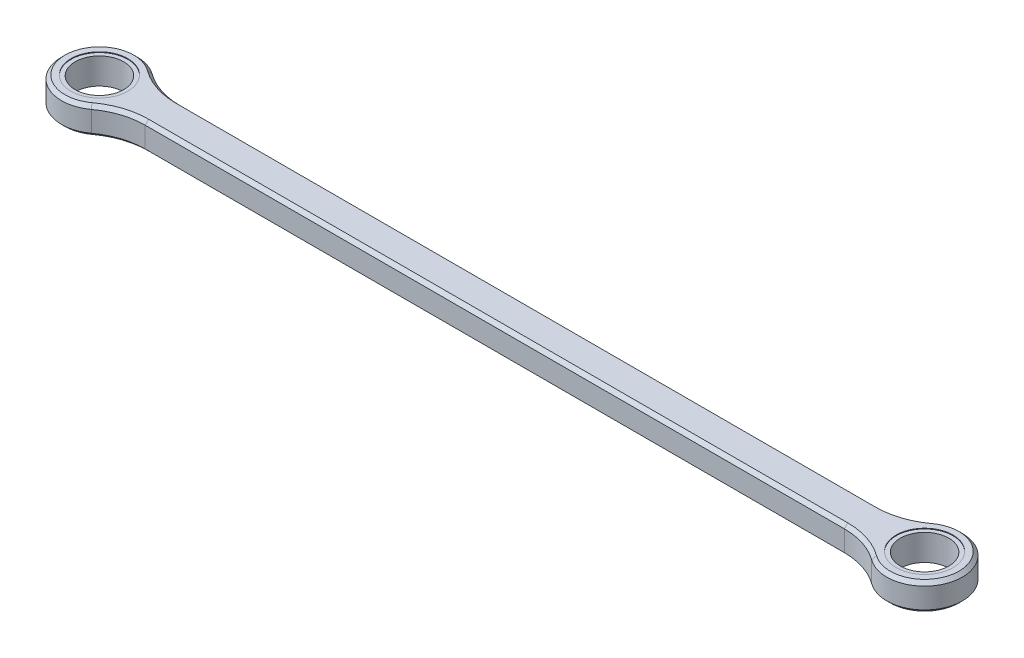
ISO-10303-21;
HEADER;
FILE_DESCRIPTION(('STEP AP214'),'2;1');
FILE_NAME('part.step','',(''),(''),'','','');
FILE_SCHEMA(('AUTOMOTIVE_DESIGN { 1 0 10303 214 1 1 1 1 }'));
ENDSEC;
DATA;
#1=APPLICATION_CONTEXT('core data for automotive mechanical design processes');
#2=APPLICATION_PROTOCOL_DEFINITION('international standard','automotive_design',2000,#1);
#3=PRODUCT_CONTEXT('',#1,'mechanical');
#4=PRODUCT('Part','Part','',(#3));
#5=PRODUCT_RELATED_PRODUCT_CATEGORY('part','',(#4));
#6=PRODUCT_DEFINITION_FORMATION('','',#4);
#7=PRODUCT_DEFINITION_CONTEXT('part definition',#1,'design');
#8=PRODUCT_DEFINITION('design','',#6,#7);
#9=PRODUCT_DEFINITION_SHAPE('','',#8);
#10=(LENGTH_UNIT() NAMED_UNIT(*) SI_UNIT(.MILLI.,.METRE.));
#11=(NAMED_UNIT(*) PLANE_ANGLE_UNIT() SI_UNIT($,.RADIAN.));
#12=(NAMED_UNIT(*) SI_UNIT($,.STERADIAN.) SOLID_ANGLE_UNIT());
#13=UNCERTAINTY_MEASURE_WITH_UNIT(LENGTH_MEASURE(1.E-05),#10,'distance_accuracy_value','');
#14=(GEOMETRIC_REPRESENTATION_CONTEXT(3) GLOBAL_UNCERTAINTY_ASSIGNED_CONTEXT((#13)) GLOBAL_UNIT_ASSIGNED_CONTEXT((#10,
#11,#12)) REPRESENTATION_CONTEXT('',''));
#15=CARTESIAN_POINT('',(0.,0.,0.));
#16=DIRECTION('',(0.,0.,1.));
#17=DIRECTION('',(1.,0.,0.));
#18=AXIS2_PLACEMENT_3D('',#15,#16,#17);
#19=CARTESIAN_POINT('',(0.,4.,0.));
#20=DIRECTION('',(0.,-1.,0.));
#21=DIRECTION('',(0.,0.,-1.));
#22=AXIS2_PLACEMENT_3D('',#19,#20,#21);
#23=CYLINDRICAL_SURFACE('',#22,3.525);
#24=CARTESIAN_POINT('',(0.,3.9,0.));
#25=DIRECTION('',(0.,1.,0.));
#26=DIRECTION('',(0.,0.,1.));
#27=AXIS2_PLACEMENT_3D('',#24,#25,#26);
#28=CIRCLE('',#27,3.525);
#29=CARTESIAN_POINT('',(0.,3.9,3.525));
#30=VERTEX_POINT('',#29);
#31=EDGE_CURVE('E285',#30,#30,#28,.T.);
#32=ORIENTED_EDGE('',*,*,#31,.T.);
#33=EDGE_LOOP('',(#32));
#34=FACE_BOUND('',#33,.T.);
#35=CARTESIAN_POINT('',(0.,0.0999999999999998,0.));
#36=DIRECTION('',(0.,-1.,0.));
#37=DIRECTION('',(0.,0.,-1.));
#38=AXIS2_PLACEMENT_3D('',#35,#36,#37);
#39=CIRCLE('',#38,3.525);
#40=CARTESIAN_POINT('',(0.,0.0999999999999998,-3.525));
#41=VERTEX_POINT('',#40);
#42=EDGE_CURVE('E45',#41,#41,#39,.T.);
#43=ORIENTED_EDGE('',*,*,#42,.T.);
#44=EDGE_LOOP('',(#43));
#45=FACE_BOUND('',#44,.T.);
#46=ADVANCED_FACE('F40',(#34,#45),#23,.F.);
#47=CARTESIAN_POINT('',(120.,4.,0.));
#48=DIRECTION('',(0.,-1.,0.));
#49=DIRECTION('',(0.,0.,-1.));
#50=AXIS2_PLACEMENT_3D('',#47,#48,#49);
#51=CYLINDRICAL_SURFACE('',#50,3.52500000000001);
#52=CARTESIAN_POINT('',(120.,3.9,0.));
#53=DIRECTION('',(0.,1.,0.));
#54=DIRECTION('',(0.,0.,1.));
#55=AXIS2_PLACEMENT_3D('',#52,#53,#54);
#56=CIRCLE('',#55,3.52500000000001);
#57=CARTESIAN_POINT('',(120.,3.9,3.52500000000001));
#58=VERTEX_POINT('',#57);
#59=EDGE_CURVE('E304',#58,#58,#56,.T.);
#60=ORIENTED_EDGE('',*,*,#59,.T.);
#61=EDGE_LOOP('',(#60));
#62=FACE_BOUND('',#61,.T.);
#63=CARTESIAN_POINT('',(120.,0.0999999999999998,0.));
#64=DIRECTION('',(0.,-1.,0.));
#65=DIRECTION('',(0.,0.,-1.));
#66=AXIS2_PLACEMENT_3D('',#63,#64,#65);
#67=CIRCLE('',#66,3.52500000000001);
#68=CARTESIAN_POINT('',(120.,0.0999999999999998,-3.52500000000001));
#69=VERTEX_POINT('',#68);
#70=EDGE_CURVE('E309',#69,#69,#67,.T.);
#71=ORIENTED_EDGE('',*,*,#70,.T.);
#72=EDGE_LOOP('',(#71));
#73=FACE_BOUND('',#72,.T.);
#74=ADVANCED_FACE('F411',(#62,#73),#51,.F.);
#75=CARTESIAN_POINT('',(0.,4.,0.));
#76=DIRECTION('',(0.,1.,0.));
#77=DIRECTION('',(0.,0.,1.));
#78=AXIS2_PLACEMENT_3D('',#75,#76,#77);
#79=PLANE('',#78);
#80=CARTESIAN_POINT('',(0.,4.,0.));
#81=DIRECTION('',(0.,1.,0.));
#82=DIRECTION('',(0.,0.,1.));
#83=AXIS2_PLACEMENT_3D('',#80,#81,#82);
#84=CIRCLE('',#83,4.125);
#85=CARTESIAN_POINT('',(0.,4.,4.125));
#86=VERTEX_POINT('',#85);
#87=EDGE_CURVE('E332',#86,#86,#84,.T.);
#88=ORIENTED_EDGE('',*,*,#87,.F.);
#89=EDGE_LOOP('',(#88));
#90=FACE_BOUND('',#89,.T.);
#91=CARTESIAN_POINT('',(120.,4.,0.));
#92=DIRECTION('',(0.,1.,0.));
#93=DIRECTION('',(0.,0.,1.));
#94=AXIS2_PLACEMENT_3D('',#91,#92,#93);
#95=CIRCLE('',#94,4.125);
#96=CARTESIAN_POINT('',(120.,4.,4.125));
#97=VERTEX_POINT('',#96);
#98=EDGE_CURVE('E335',#97,#97,#95,.T.);
#99=ORIENTED_EDGE('',*,*,#98,.F.);
#100=EDGE_LOOP('',(#99));
#101=FACE_BOUND('',#100,.T.);
#102=CARTESIAN_POINT('',(9.16515138991168,4.,12.5));
#103=DIRECTION('',(0.,1.,0.));
#104=DIRECTION('',(0.,0.,1.));
#105=AXIS2_PLACEMENT_3D('',#102,#103,#104);
#106=CIRCLE('',#105,10.5);
#107=CARTESIAN_POINT('',(2.95650044835861,4.,4.03225806451613));
#108=VERTEX_POINT('',#107);
#109=CARTESIAN_POINT('',(9.16515138991168,4.,2.));
#110=VERTEX_POINT('',#109);
#111=EDGE_CURVE('E65',#108,#110,#106,.F.);
#112=ORIENTED_EDGE('',*,*,#111,.T.);
#113=DIRECTION('',(1.,0.,0.));
#114=VECTOR('',#113,1.);
#115=CARTESIAN_POINT('',(110.834848610088,4.,2.));
#116=LINE('',#115,#114);
#117=CARTESIAN_POINT('',(110.834848610088,4.,2.));
#118=VERTEX_POINT('',#117);
#119=EDGE_CURVE('E11',#110,#118,#116,.T.);
#120=ORIENTED_EDGE('',*,*,#119,.T.);
#121=CARTESIAN_POINT('',(110.834848610088,4.,12.5));
#122=DIRECTION('',(0.,1.,0.));
#123=DIRECTION('',(0.,0.,1.));
#124=AXIS2_PLACEMENT_3D('',#121,#122,#123);
#125=CIRCLE('',#124,10.5);
#126=CARTESIAN_POINT('',(117.043499551641,4.,4.03225806451613));
#127=VERTEX_POINT('',#126);
#128=EDGE_CURVE('E50',#118,#127,#125,.F.);
#129=ORIENTED_EDGE('',*,*,#128,.T.);
#130=CARTESIAN_POINT('',(120.,4.,0.));
#131=DIRECTION('',(0.,1.,0.));
#132=DIRECTION('',(0.,0.,1.));
#133=AXIS2_PLACEMENT_3D('',#130,#131,#132);
#134=CIRCLE('',#133,5.);
#135=CARTESIAN_POINT('',(117.043499551641,4.,-4.03225806451613));
#136=VERTEX_POINT('',#135);
#137=EDGE_CURVE('E261',#127,#136,#134,.T.);
#138=ORIENTED_EDGE('',*,*,#137,.T.);
#139=CARTESIAN_POINT('',(110.834848610088,4.,-12.5));
#140=DIRECTION('',(0.,1.,0.));
#141=DIRECTION('',(0.,0.,1.));
#142=AXIS2_PLACEMENT_3D('',#139,#140,#141);
#143=CIRCLE('',#142,10.5);
#144=CARTESIAN_POINT('',(110.834848610088,4.,-2.));
#145=VERTEX_POINT('',#144);
#146=EDGE_CURVE('E257',#136,#145,#143,.F.);
#147=ORIENTED_EDGE('',*,*,#146,.T.);
#148=DIRECTION('',(-1.,0.,0.));
#149=VECTOR('',#148,1.);
#150=CARTESIAN_POINT('',(9.16515138991168,4.,-2.));
#151=LINE('',#150,#149);
#152=CARTESIAN_POINT('',(9.16515138991168,4.,-2.));
#153=VERTEX_POINT('',#152);
#154=EDGE_CURVE('E253',#145,#153,#151,.T.);
#155=ORIENTED_EDGE('',*,*,#154,.T.);
#156=CARTESIAN_POINT('',(9.16515138991168,4.,-12.5));
#157=DIRECTION('',(0.,1.,0.));
#158=DIRECTION('',(0.,0.,1.));
#159=AXIS2_PLACEMENT_3D('',#156,#157,#158);
#160=CIRCLE('',#159,10.5);
#161=CARTESIAN_POINT('',(2.95650044835861,4.,-4.03225806451613));
#162=VERTEX_POINT('',#161);
#163=EDGE_CURVE('E255',#153,#162,#160,.F.);
#164=ORIENTED_EDGE('',*,*,#163,.T.);
#165=CARTESIAN_POINT('',(0.,4.,0.));
#166=DIRECTION('',(0.,1.,0.));
#167=DIRECTION('',(0.,0.,1.));
#168=AXIS2_PLACEMENT_3D('',#165,#166,#167);
#169=CIRCLE('',#168,5.);
#170=EDGE_CURVE('E259',#162,#108,#169,.T.);
#171=ORIENTED_EDGE('',*,*,#170,.T.);
#172=EDGE_LOOP('',(#112,#120,#129,#138,#147,#155,#164,#171));
#173=FACE_BOUND('',#172,.T.);
#174=ADVANCED_FACE('F392',(#90,#101,#173),#79,.T.);
#175=CARTESIAN_POINT('',(0.,0.,0.));
#176=DIRECTION('',(0.,1.,0.));
#177=DIRECTION('',(0.,0.,1.));
#178=AXIS2_PLACEMENT_3D('',#175,#176,#177);
#179=PLANE('',#178);
#180=CARTESIAN_POINT('',(0.,0.,0.));
#181=DIRECTION('',(0.,-1.,0.));
#182=DIRECTION('',(0.,0.,-1.));
#183=AXIS2_PLACEMENT_3D('',#180,#181,#182);
#184=CIRCLE('',#183,4.125);
#185=CARTESIAN_POINT('',(0.,0.,-4.125));
#186=VERTEX_POINT('',#185);
#187=EDGE_CURVE('E317',#186,#186,#184,.T.);
#188=ORIENTED_EDGE('',*,*,#187,.F.);
#189=EDGE_LOOP('',(#188));
#190=FACE_BOUND('',#189,.T.);
#191=CARTESIAN_POINT('',(120.,0.,0.));
#192=DIRECTION('',(0.,-1.,0.));
#193=DIRECTION('',(0.,0.,-1.));
#194=AXIS2_PLACEMENT_3D('',#191,#192,#193);
#195=CIRCLE('',#194,4.125);
#196=CARTESIAN_POINT('',(120.,0.,-4.125));
#197=VERTEX_POINT('',#196);
#198=EDGE_CURVE('E322',#197,#197,#195,.T.);
#199=ORIENTED_EDGE('',*,*,#198,.F.);
#200=EDGE_LOOP('',(#199));
#201=FACE_BOUND('',#200,.T.);
#202=CARTESIAN_POINT('',(110.834848610088,0.,12.5));
#203=DIRECTION('',(0.,1.,0.));
#204=DIRECTION('',(0.,0.,1.));
#205=AXIS2_PLACEMENT_3D('',#202,#203,#204);
#206=CIRCLE('',#205,10.5);
#207=CARTESIAN_POINT('',(117.043499551641,0.,4.03225806451613));
#208=VERTEX_POINT('',#207);
#209=CARTESIAN_POINT('',(110.834848610088,0.,2.));
#210=VERTEX_POINT('',#209);
#211=EDGE_CURVE('E226',#208,#210,#206,.T.);
#212=ORIENTED_EDGE('',*,*,#211,.T.);
#213=DIRECTION('',(-1.,0.,0.));
#214=VECTOR('',#213,1.);
#215=CARTESIAN_POINT('',(0.,0.,2.));
#216=LINE('',#215,#214);
#217=CARTESIAN_POINT('',(9.16515138991168,0.,2.));
#218=VERTEX_POINT('',#217);
#219=EDGE_CURVE('E165',#210,#218,#216,.T.);
#220=ORIENTED_EDGE('',*,*,#219,.T.);
#221=CARTESIAN_POINT('',(9.16515138991168,0.,12.5));
#222=DIRECTION('',(0.,1.,0.));
#223=DIRECTION('',(0.,0.,1.));
#224=AXIS2_PLACEMENT_3D('',#221,#222,#223);
#225=CIRCLE('',#224,10.5);
#226=CARTESIAN_POINT('',(2.95650044835861,0.,4.03225806451613));
#227=VERTEX_POINT('',#226);
#228=EDGE_CURVE('E224',#218,#227,#225,.T.);
#229=ORIENTED_EDGE('',*,*,#228,.T.);
#230=CARTESIAN_POINT('',(0.,0.,0.));
#231=DIRECTION('',(0.,1.,0.));
#232=DIRECTION('',(0.,0.,1.));
#233=AXIS2_PLACEMENT_3D('',#230,#231,#232);
#234=CIRCLE('',#233,5.);
#235=CARTESIAN_POINT('',(2.95650044835861,0.,-4.03225806451613));
#236=VERTEX_POINT('',#235);
#237=EDGE_CURVE('E220',#227,#236,#234,.F.);
#238=ORIENTED_EDGE('',*,*,#237,.T.);
#239=CARTESIAN_POINT('',(9.16515138991168,0.,-12.5));
#240=DIRECTION('',(0.,1.,0.));
#241=DIRECTION('',(0.,0.,1.));
#242=AXIS2_PLACEMENT_3D('',#239,#240,#241);
#243=CIRCLE('',#242,10.5);
#244=CARTESIAN_POINT('',(9.16515138991168,0.,-2.));
#245=VERTEX_POINT('',#244);
#246=EDGE_CURVE('E216',#236,#245,#243,.T.);
#247=ORIENTED_EDGE('',*,*,#246,.T.);
#248=DIRECTION('',(1.,0.,0.));
#249=VECTOR('',#248,1.);
#250=CARTESIAN_POINT('',(0.,0.,-2.));
#251=LINE('',#250,#249);
#252=CARTESIAN_POINT('',(110.834848610088,0.,-2.));
#253=VERTEX_POINT('',#252);
#254=EDGE_CURVE('E192',#245,#253,#251,.T.);
#255=ORIENTED_EDGE('',*,*,#254,.T.);
#256=CARTESIAN_POINT('',(110.834848610088,0.,-12.5));
#257=DIRECTION('',(0.,1.,0.));
#258=DIRECTION('',(0.,0.,1.));
#259=AXIS2_PLACEMENT_3D('',#256,#257,#258);
#260=CIRCLE('',#259,10.5);
#261=CARTESIAN_POINT('',(117.043499551641,0.,-4.03225806451613));
#262=VERTEX_POINT('',#261);
#263=EDGE_CURVE('E218',#253,#262,#260,.T.);
#264=ORIENTED_EDGE('',*,*,#263,.T.);
#265=CARTESIAN_POINT('',(120.,0.,0.));
#266=DIRECTION('',(0.,1.,0.));
#267=DIRECTION('',(0.,0.,1.));
#268=AXIS2_PLACEMENT_3D('',#265,#266,#267);
#269=CIRCLE('',#268,5.);
#270=EDGE_CURVE('E222',#262,#208,#269,.F.);
#271=ORIENTED_EDGE('',*,*,#270,.T.);
#272=EDGE_LOOP('',(#212,#220,#229,#238,#247,#255,#264,#271));
#273=FACE_BOUND('',#272,.T.);
#274=ADVANCED_FACE('F425',(#190,#201,#273),#179,.F.);
#275=CARTESIAN_POINT('',(0.,4.,0.));
#276=DIRECTION('',(0.,-1.,0.));
#277=DIRECTION('',(0.,0.,-1.));
#278=AXIS2_PLACEMENT_3D('',#275,#276,#277);
#279=CYLINDRICAL_SURFACE('',#278,5.5);
#280=DIRECTION('',(0.,-1.,0.));
#281=VECTOR('',#280,1.);
#282=CARTESIAN_POINT('',(3.25215049319447,4.,-4.43548387096774));
#283=LINE('',#282,#281);
#284=CARTESIAN_POINT('',(3.25215049319447,3.5,-4.43548387096774));
#285=VERTEX_POINT('',#284);
#286=CARTESIAN_POINT('',(3.25215049319447,0.5,-4.43548387096774));
#287=VERTEX_POINT('',#286);
#288=EDGE_CURVE('E208',#285,#287,#283,.T.);
#289=ORIENTED_EDGE('',*,*,#288,.T.);
#290=CARTESIAN_POINT('',(0.,0.5,0.));
#291=DIRECTION('',(0.,1.,0.));
#292=DIRECTION('',(0.,0.,1.));
#293=AXIS2_PLACEMENT_3D('',#290,#291,#292);
#294=CIRCLE('',#293,5.5);
#295=CARTESIAN_POINT('',(3.25215049319447,0.5,4.43548387096774));
#296=VERTEX_POINT('',#295);
#297=EDGE_CURVE('E239',#287,#296,#294,.T.);
#298=ORIENTED_EDGE('',*,*,#297,.T.);
#299=DIRECTION('',(0.,-1.,0.));
#300=VECTOR('',#299,1.);
#301=CARTESIAN_POINT('',(3.25215049319447,4.,4.43548387096774));
#302=LINE('',#301,#300);
#303=CARTESIAN_POINT('',(3.25215049319447,3.5,4.43548387096774));
#304=VERTEX_POINT('',#303);
#305=EDGE_CURVE('E211',#296,#304,#302,.F.);
#306=ORIENTED_EDGE('',*,*,#305,.T.);
#307=CARTESIAN_POINT('',(0.,3.5,0.));
#308=DIRECTION('',(0.,1.,0.));
#309=DIRECTION('',(0.,0.,1.));
#310=AXIS2_PLACEMENT_3D('',#307,#308,#309);
#311=CIRCLE('',#310,5.5);
#312=EDGE_CURVE('E237',#304,#285,#311,.F.);
#313=ORIENTED_EDGE('',*,*,#312,.T.);
#314=EDGE_LOOP('',(#289,#298,#306,#313));
#315=FACE_BOUND('',#314,.T.);
#316=ADVANCED_FACE('F380',(#315),#279,.T.);
#317=CARTESIAN_POINT('',(4.89897948556636,4.,2.5));
#318=DIRECTION('',(0.,0.,-1.));
#319=DIRECTION('',(-1.,0.,0.));
#320=AXIS2_PLACEMENT_3D('',#317,#318,#319);
#321=PLANE('',#320);
#322=DIRECTION('',(0.,1.,0.));
#323=VECTOR('',#322,1.);
#324=CARTESIAN_POINT('',(9.16515138991168,0.,2.5));
#325=LINE('',#324,#323);
#326=CARTESIAN_POINT('',(9.16515138991168,3.5,2.5));
#327=VERTEX_POINT('',#326);
#328=CARTESIAN_POINT('',(9.16515138991168,0.5,2.5));
#329=VERTEX_POINT('',#328);
#330=EDGE_CURVE('E190',#327,#329,#325,.F.);
#331=ORIENTED_EDGE('',*,*,#330,.T.);
#332=DIRECTION('',(1.,0.,0.));
#333=VECTOR('',#332,1.);
#334=CARTESIAN_POINT('',(4.89897948556636,0.5,2.5));
#335=LINE('',#334,#333);
#336=CARTESIAN_POINT('',(110.834848610088,0.5,2.5));
#337=VERTEX_POINT('',#336);
#338=EDGE_CURVE('E163',#329,#337,#335,.T.);
#339=ORIENTED_EDGE('',*,*,#338,.T.);
#340=DIRECTION('',(0.,1.,0.));
#341=VECTOR('',#340,1.);
#342=CARTESIAN_POINT('',(110.834848610088,4.,2.5));
#343=LINE('',#342,#341);
#344=CARTESIAN_POINT('',(110.834848610088,3.5,2.5));
#345=VERTEX_POINT('',#344);
#346=EDGE_CURVE('E188',#337,#345,#343,.T.);
#347=ORIENTED_EDGE('',*,*,#346,.T.);
#348=DIRECTION('',(-1.,0.,0.));
#349=VECTOR('',#348,1.);
#350=CARTESIAN_POINT('',(9.16515138991168,3.5,2.5));
#351=LINE('',#350,#349);
#352=EDGE_CURVE('E193',#345,#327,#351,.T.);
#353=ORIENTED_EDGE('',*,*,#352,.T.);
#354=EDGE_LOOP('',(#331,#339,#347,#353));
#355=FACE_BOUND('',#354,.T.);
#356=ADVANCED_FACE('F186',(#355),#321,.F.);
#357=CARTESIAN_POINT('',(120.,4.,0.));
#358=DIRECTION('',(0.,-1.,0.));
#359=DIRECTION('',(0.,0.,-1.));
#360=AXIS2_PLACEMENT_3D('',#357,#358,#359);
#361=CYLINDRICAL_SURFACE('',#360,5.50000000000001);
#362=DIRECTION('',(0.,-1.,0.));
#363=VECTOR('',#362,1.);
#364=CARTESIAN_POINT('',(116.747849506806,4.,4.43548387096774));
#365=LINE('',#364,#363);
#366=CARTESIAN_POINT('',(116.747849506806,3.5,4.43548387096774));
#367=VERTEX_POINT('',#366);
#368=CARTESIAN_POINT('',(116.747849506806,0.5,4.43548387096774));
#369=VERTEX_POINT('',#368);
#370=EDGE_CURVE('E202',#367,#369,#365,.T.);
#371=ORIENTED_EDGE('',*,*,#370,.T.);
#372=CARTESIAN_POINT('',(120.,0.5,0.));
#373=DIRECTION('',(0.,1.,0.));
#374=DIRECTION('',(0.,0.,1.));
#375=AXIS2_PLACEMENT_3D('',#372,#373,#374);
#376=CIRCLE('',#375,5.50000000000001);
#377=CARTESIAN_POINT('',(116.747849506806,0.5,-4.43548387096774));
#378=VERTEX_POINT('',#377);
#379=EDGE_CURVE('E235',#369,#378,#376,.T.);
#380=ORIENTED_EDGE('',*,*,#379,.T.);
#381=DIRECTION('',(0.,-1.,0.));
#382=VECTOR('',#381,1.);
#383=CARTESIAN_POINT('',(116.747849506806,4.,-4.43548387096774));
#384=LINE('',#383,#382);
#385=CARTESIAN_POINT('',(116.747849506806,3.5,-4.43548387096774));
#386=VERTEX_POINT('',#385);
#387=EDGE_CURVE('E282',#378,#386,#384,.F.);
#388=ORIENTED_EDGE('',*,*,#387,.T.);
#389=CARTESIAN_POINT('',(120.,3.5,0.));
#390=DIRECTION('',(0.,1.,0.));
#391=DIRECTION('',(0.,0.,1.));
#392=AXIS2_PLACEMENT_3D('',#389,#390,#391);
#393=CIRCLE('',#392,5.50000000000001);
#394=EDGE_CURVE('E233',#386,#367,#393,.F.);
#395=ORIENTED_EDGE('',*,*,#394,.T.);
#396=EDGE_LOOP('',(#371,#380,#388,#395));
#397=FACE_BOUND('',#396,.T.);
#398=ADVANCED_FACE('F343',(#397),#361,.T.);
#399=CARTESIAN_POINT('',(4.89897948556636,4.,-2.5));
#400=DIRECTION('',(0.,0.,1.));
#401=DIRECTION('',(1.,0.,0.));
#402=AXIS2_PLACEMENT_3D('',#399,#400,#401);
#403=PLANE('',#402);
#404=DIRECTION('',(0.,1.,0.));
#405=VECTOR('',#404,1.);
#406=CARTESIAN_POINT('',(110.834848610088,0.,-2.5));
#407=LINE('',#406,#405);
#408=CARTESIAN_POINT('',(110.834848610088,3.5,-2.5));
#409=VERTEX_POINT('',#408);
#410=CARTESIAN_POINT('',(110.834848610088,0.5,-2.5));
#411=VERTEX_POINT('',#410);
#412=EDGE_CURVE('E200',#409,#411,#407,.F.);
#413=ORIENTED_EDGE('',*,*,#412,.T.);
#414=DIRECTION('',(-1.,0.,0.));
#415=VECTOR('',#414,1.);
#416=CARTESIAN_POINT('',(4.89897948556636,0.5,-2.5));
#417=LINE('',#416,#415);
#418=CARTESIAN_POINT('',(9.16515138991168,0.5,-2.5));
#419=VERTEX_POINT('',#418);
#420=EDGE_CURVE('E251',#411,#419,#417,.T.);
#421=ORIENTED_EDGE('',*,*,#420,.T.);
#422=DIRECTION('',(0.,1.,0.));
#423=VECTOR('',#422,1.);
#424=CARTESIAN_POINT('',(9.16515138991168,4.,-2.5));
#425=LINE('',#424,#423);
#426=CARTESIAN_POINT('',(9.16515138991168,3.5,-2.5));
#427=VERTEX_POINT('',#426);
#428=EDGE_CURVE('E197',#419,#427,#425,.T.);
#429=ORIENTED_EDGE('',*,*,#428,.T.);
#430=DIRECTION('',(1.,0.,0.));
#431=VECTOR('',#430,1.);
#432=CARTESIAN_POINT('',(110.834848610088,3.5,-2.5));
#433=LINE('',#432,#431);
#434=EDGE_CURVE('E249',#427,#409,#433,.T.);
#435=ORIENTED_EDGE('',*,*,#434,.T.);
#436=EDGE_LOOP('',(#413,#421,#429,#435));
#437=FACE_BOUND('',#436,.T.);
#438=ADVANCED_FACE('F362',(#437),#403,.F.);
#439=CARTESIAN_POINT('',(110.834848610088,4.,12.5));
#440=DIRECTION('',(0.,-1.,0.));
#441=DIRECTION('',(0.,0.,-1.));
#442=AXIS2_PLACEMENT_3D('',#439,#440,#441);
#443=CYLINDRICAL_SURFACE('',#442,10.);
#444=ORIENTED_EDGE('',*,*,#346,.F.);
#445=CARTESIAN_POINT('',(110.834848610088,0.5,12.5));
#446=DIRECTION('',(0.,1.,0.));
#447=DIRECTION('',(0.,0.,1.));
#448=AXIS2_PLACEMENT_3D('',#445,#446,#447);
#449=CIRCLE('',#448,10.);
#450=EDGE_CURVE('E172',#337,#369,#449,.F.);
#451=ORIENTED_EDGE('',*,*,#450,.T.);
#452=ORIENTED_EDGE('',*,*,#370,.F.);
#453=CARTESIAN_POINT('',(110.834848610088,3.5,12.5));
#454=DIRECTION('',(0.,1.,0.));
#455=DIRECTION('',(0.,0.,1.));
#456=AXIS2_PLACEMENT_3D('',#453,#454,#455);
#457=CIRCLE('',#456,10.);
#458=EDGE_CURVE('E181',#367,#345,#457,.T.);
#459=ORIENTED_EDGE('',*,*,#458,.T.);
#460=EDGE_LOOP('',(#444,#451,#452,#459));
#461=FACE_BOUND('',#460,.T.);
#462=ADVANCED_FACE('F195',(#461),#443,.F.);
#463=CARTESIAN_POINT('',(110.834848610088,4.,-12.5));
#464=DIRECTION('',(0.,-1.,0.));
#465=DIRECTION('',(0.,0.,-1.));
#466=AXIS2_PLACEMENT_3D('',#463,#464,#465);
#467=CYLINDRICAL_SURFACE('',#466,10.);
#468=ORIENTED_EDGE('',*,*,#387,.F.);
#469=CARTESIAN_POINT('',(110.834848610088,0.5,-12.5));
#470=DIRECTION('',(0.,1.,0.));
#471=DIRECTION('',(0.,0.,1.));
#472=AXIS2_PLACEMENT_3D('',#469,#470,#471);
#473=CIRCLE('',#472,10.);
#474=EDGE_CURVE('E243',#378,#411,#473,.F.);
#475=ORIENTED_EDGE('',*,*,#474,.T.);
#476=ORIENTED_EDGE('',*,*,#412,.F.);
#477=CARTESIAN_POINT('',(110.834848610088,3.5,-12.5));
#478=DIRECTION('',(0.,1.,0.));
#479=DIRECTION('',(0.,0.,1.));
#480=AXIS2_PLACEMENT_3D('',#477,#478,#479);
#481=CIRCLE('',#480,10.);
#482=EDGE_CURVE('E241',#409,#386,#481,.T.);
#483=ORIENTED_EDGE('',*,*,#482,.T.);
#484=EDGE_LOOP('',(#468,#475,#476,#483));
#485=FACE_BOUND('',#484,.T.);
#486=ADVANCED_FACE('F358',(#485),#467,.F.);
#487=CARTESIAN_POINT('',(9.16515138991168,4.,12.5));
#488=DIRECTION('',(0.,-1.,0.));
#489=DIRECTION('',(0.,0.,-1.));
#490=AXIS2_PLACEMENT_3D('',#487,#488,#489);
#491=CYLINDRICAL_SURFACE('',#490,10.);
#492=ORIENTED_EDGE('',*,*,#305,.F.);
#493=CARTESIAN_POINT('',(9.16515138991168,0.5,12.5));
#494=DIRECTION('',(0.,1.,0.));
#495=DIRECTION('',(0.,0.,1.));
#496=AXIS2_PLACEMENT_3D('',#493,#494,#495);
#497=CIRCLE('',#496,10.);
#498=EDGE_CURVE('E231',#296,#329,#497,.F.);
#499=ORIENTED_EDGE('',*,*,#498,.T.);
#500=ORIENTED_EDGE('',*,*,#330,.F.);
#501=CARTESIAN_POINT('',(9.16515138991168,3.5,12.5));
#502=DIRECTION('',(0.,1.,0.));
#503=DIRECTION('',(0.,0.,1.));
#504=AXIS2_PLACEMENT_3D('',#501,#502,#503);
#505=CIRCLE('',#504,10.);
#506=EDGE_CURVE('E180',#327,#304,#505,.T.);
#507=ORIENTED_EDGE('',*,*,#506,.T.);
#508=EDGE_LOOP('',(#492,#499,#500,#507));
#509=FACE_BOUND('',#508,.T.);
#510=ADVANCED_FACE('F442',(#509),#491,.F.);
#511=CARTESIAN_POINT('',(9.16515138991168,4.,-12.5));
#512=DIRECTION('',(0.,-1.,0.));
#513=DIRECTION('',(0.,0.,-1.));
#514=AXIS2_PLACEMENT_3D('',#511,#512,#513);
#515=CYLINDRICAL_SURFACE('',#514,10.);
#516=ORIENTED_EDGE('',*,*,#428,.F.);
#517=CARTESIAN_POINT('',(9.16515138991168,0.5,-12.5));
#518=DIRECTION('',(0.,1.,0.));
#519=DIRECTION('',(0.,0.,1.));
#520=AXIS2_PLACEMENT_3D('',#517,#518,#519);
#521=CIRCLE('',#520,10.);
#522=EDGE_CURVE('E247',#419,#287,#521,.F.);
#523=ORIENTED_EDGE('',*,*,#522,.T.);
#524=ORIENTED_EDGE('',*,*,#288,.F.);
#525=CARTESIAN_POINT('',(9.16515138991168,3.5,-12.5));
#526=DIRECTION('',(0.,1.,0.));
#527=DIRECTION('',(0.,0.,1.));
#528=AXIS2_PLACEMENT_3D('',#525,#526,#527);
#529=CIRCLE('',#528,10.);
#530=EDGE_CURVE('E245',#285,#427,#529,.T.);
#531=ORIENTED_EDGE('',*,*,#530,.T.);
#532=EDGE_LOOP('',(#516,#523,#524,#531));
#533=FACE_BOUND('',#532,.T.);
#534=ADVANCED_FACE('F377',(#533),#515,.F.);
#535=CARTESIAN_POINT('',(4.89897948556636,0.5,-2.5));
#536=DIRECTION('',(0.,0.707106781186547,0.707106781186547));
#537=DIRECTION('',(-1.,0.,0.));
#538=AXIS2_PLACEMENT_3D('',#535,#536,#537);
#539=PLANE('',#538);
#540=DIRECTION('',(0.,0.707106781186547,-0.707106781186547));
#541=VECTOR('',#540,1.);
#542=CARTESIAN_POINT('',(110.834848610088,0.,-2.));
#543=LINE('',#542,#541);
#544=EDGE_CURVE('E276',#253,#411,#543,.T.);
#545=ORIENTED_EDGE('',*,*,#544,.F.);
#546=ORIENTED_EDGE('',*,*,#254,.F.);
#547=DIRECTION('',(0.,-0.707106781186547,0.707106781186547));
#548=VECTOR('',#547,1.);
#549=CARTESIAN_POINT('',(9.16515138991168,0.5,-2.5));
#550=LINE('',#549,#548);
#551=EDGE_CURVE('E279',#419,#245,#550,.T.);
#552=ORIENTED_EDGE('',*,*,#551,.F.);
#553=ORIENTED_EDGE('',*,*,#420,.F.);
#554=EDGE_LOOP('',(#545,#546,#552,#553));
#555=FACE_BOUND('',#554,.T.);
#556=ADVANCED_FACE('F367',(#555),#539,.F.);
#557=CARTESIAN_POINT('',(9.16515138991168,0.,-12.5));
#558=DIRECTION('',(0.,-1.,0.));
#559=DIRECTION('',(0.,0.,-1.));
#560=AXIS2_PLACEMENT_3D('',#557,#558,#559);
#561=CONICAL_SURFACE('',#560,10.5,0.785398163397448);
#562=ORIENTED_EDGE('',*,*,#551,.T.);
#563=ORIENTED_EDGE('',*,*,#246,.F.);
#564=DIRECTION('',(-0.418112303123088,-0.707106781186548,0.570247404182699));
#565=VECTOR('',#564,1.);
#566=CARTESIAN_POINT('',(3.25215049319447,0.5,-4.43548387096774));
#567=LINE('',#566,#565);
#568=EDGE_CURVE('E273',#287,#236,#567,.T.);
#569=ORIENTED_EDGE('',*,*,#568,.F.);
#570=ORIENTED_EDGE('',*,*,#522,.F.);
#571=EDGE_LOOP('',(#562,#563,#569,#570));
#572=FACE_BOUND('',#571,.T.);
#573=ADVANCED_FACE('F373',(#572),#561,.F.);
#574=CARTESIAN_POINT('',(110.834848610088,0.,-12.5));
#575=DIRECTION('',(0.,-1.,0.));
#576=DIRECTION('',(0.,0.,-1.));
#577=AXIS2_PLACEMENT_3D('',#574,#575,#576);
#578=CONICAL_SURFACE('',#577,10.5,0.785398163397448);
#579=ORIENTED_EDGE('',*,*,#544,.T.);
#580=ORIENTED_EDGE('',*,*,#474,.F.);
#581=DIRECTION('',(-0.418112303123094,0.707106781186548,-0.570247404182694));
#582=VECTOR('',#581,1.);
#583=CARTESIAN_POINT('',(117.043499551641,0.,-4.03225806451613));
#584=LINE('',#583,#582);
#585=EDGE_CURVE('E270',#262,#378,#584,.T.);
#586=ORIENTED_EDGE('',*,*,#585,.F.);
#587=ORIENTED_EDGE('',*,*,#263,.F.);
#588=EDGE_LOOP('',(#579,#580,#586,#587));
#589=FACE_BOUND('',#588,.T.);
#590=ADVANCED_FACE('F354',(#589),#578,.F.);
#591=CARTESIAN_POINT('',(0.,0.5,0.));
#592=DIRECTION('',(0.,1.,0.));
#593=DIRECTION('',(0.,0.,1.));
#594=AXIS2_PLACEMENT_3D('',#591,#592,#593);
#595=CONICAL_SURFACE('',#594,5.5,0.785398163397448);
#596=ORIENTED_EDGE('',*,*,#568,.T.);
#597=ORIENTED_EDGE('',*,*,#237,.F.);
#598=DIRECTION('',(-0.418112303123088,-0.707106781186548,-0.570247404182699));
#599=VECTOR('',#598,1.);
#600=CARTESIAN_POINT('',(3.25215049319447,0.5,4.43548387096774));
#601=LINE('',#600,#599);
#602=EDGE_CURVE('E267',#296,#227,#601,.T.);
#603=ORIENTED_EDGE('',*,*,#602,.F.);
#604=ORIENTED_EDGE('',*,*,#297,.F.);
#605=EDGE_LOOP('',(#596,#597,#603,#604));
#606=FACE_BOUND('',#605,.T.);
#607=ADVANCED_FACE('F471',(#606),#595,.T.);
#608=CARTESIAN_POINT('',(120.,0.5,0.));
#609=DIRECTION('',(0.,1.,0.));
#610=DIRECTION('',(0.,0.,1.));
#611=AXIS2_PLACEMENT_3D('',#608,#609,#610);
#612=CONICAL_SURFACE('',#611,5.50000000000001,0.785398163397448);
#613=ORIENTED_EDGE('',*,*,#585,.T.);
#614=ORIENTED_EDGE('',*,*,#379,.F.);
#615=DIRECTION('',(-0.418112303123094,0.707106781186546,0.570247404182697));
#616=VECTOR('',#615,1.);
#617=CARTESIAN_POINT('',(117.043499551641,0.,4.03225806451613));
#618=LINE('',#617,#616);
#619=EDGE_CURVE('E175',#208,#369,#618,.T.);
#620=ORIENTED_EDGE('',*,*,#619,.F.);
#621=ORIENTED_EDGE('',*,*,#270,.F.);
#622=EDGE_LOOP('',(#613,#614,#620,#621));
#623=FACE_BOUND('',#622,.T.);
#624=ADVANCED_FACE('F348',(#623),#612,.T.);
#625=CARTESIAN_POINT('',(9.16515138991168,0.,12.5));
#626=DIRECTION('',(0.,-1.,0.));
#627=DIRECTION('',(0.,0.,-1.));
#628=AXIS2_PLACEMENT_3D('',#625,#626,#627);
#629=CONICAL_SURFACE('',#628,10.5,0.785398163397448);
#630=ORIENTED_EDGE('',*,*,#602,.T.);
#631=ORIENTED_EDGE('',*,*,#228,.F.);
#632=DIRECTION('',(0.,-0.707106781186547,-0.707106781186547));
#633=VECTOR('',#632,1.);
#634=CARTESIAN_POINT('',(9.16515138991168,0.5,2.5));
#635=LINE('',#634,#633);
#636=EDGE_CURVE('E168',#329,#218,#635,.T.);
#637=ORIENTED_EDGE('',*,*,#636,.F.);
#638=ORIENTED_EDGE('',*,*,#498,.F.);
#639=EDGE_LOOP('',(#630,#631,#637,#638));
#640=FACE_BOUND('',#639,.T.);
#641=ADVANCED_FACE('F459',(#640),#629,.F.);
#642=CARTESIAN_POINT('',(110.834848610088,0.,12.5));
#643=DIRECTION('',(0.,-1.,0.));
#644=DIRECTION('',(0.,0.,-1.));
#645=AXIS2_PLACEMENT_3D('',#642,#643,#644);
#646=CONICAL_SURFACE('',#645,10.5,0.78539816339745);
#647=ORIENTED_EDGE('',*,*,#619,.T.);
#648=ORIENTED_EDGE('',*,*,#450,.F.);
#649=DIRECTION('',(0.,0.707106781186546,0.707106781186549));
#650=VECTOR('',#649,1.);
#651=CARTESIAN_POINT('',(110.834848610088,0.,2.));
#652=LINE('',#651,#650);
#653=EDGE_CURVE('E159',#210,#337,#652,.T.);
#654=ORIENTED_EDGE('',*,*,#653,.F.);
#655=ORIENTED_EDGE('',*,*,#211,.F.);
#656=EDGE_LOOP('',(#647,#648,#654,#655));
#657=FACE_BOUND('',#656,.T.);
#658=ADVANCED_FACE('F173',(#657),#646,.F.);
#659=CARTESIAN_POINT('',(4.89897948556636,0.5,2.5));
#660=DIRECTION('',(0.,0.707106781186547,-0.707106781186547));
#661=DIRECTION('',(1.,0.,0.));
#662=AXIS2_PLACEMENT_3D('',#659,#660,#661);
#663=PLANE('',#662);
#664=ORIENTED_EDGE('',*,*,#636,.T.);
#665=ORIENTED_EDGE('',*,*,#219,.F.);
#666=ORIENTED_EDGE('',*,*,#653,.T.);
#667=ORIENTED_EDGE('',*,*,#338,.F.);
#668=EDGE_LOOP('',(#664,#665,#666,#667));
#669=FACE_BOUND('',#668,.T.);
#670=ADVANCED_FACE('F161',(#669),#663,.F.);
#671=CARTESIAN_POINT('',(0.,4.,-2.));
#672=DIRECTION('',(0.,0.707106781186547,-0.707106781186547));
#673=DIRECTION('',(1.,0.,0.));
#674=AXIS2_PLACEMENT_3D('',#671,#672,#673);
#675=PLANE('',#674);
#676=DIRECTION('',(0.,0.707106781186547,0.707106781186547));
#677=VECTOR('',#676,1.);
#678=CARTESIAN_POINT('',(110.834848610088,3.5,-2.5));
#679=LINE('',#678,#677);
#680=EDGE_CURVE('E299',#409,#145,#679,.T.);
#681=ORIENTED_EDGE('',*,*,#680,.F.);
#682=ORIENTED_EDGE('',*,*,#434,.F.);
#683=DIRECTION('',(0.,-0.707106781186547,-0.707106781186547));
#684=VECTOR('',#683,1.);
#685=CARTESIAN_POINT('',(9.16515138991168,4.,-2.));
#686=LINE('',#685,#684);
#687=EDGE_CURVE('E169',#153,#427,#686,.T.);
#688=ORIENTED_EDGE('',*,*,#687,.F.);
#689=ORIENTED_EDGE('',*,*,#154,.F.);
#690=EDGE_LOOP('',(#681,#682,#688,#689));
#691=FACE_BOUND('',#690,.T.);
#692=ADVANCED_FACE('F43',(#691),#675,.T.);
#693=CARTESIAN_POINT('',(9.16515138991168,4.,-12.5));
#694=DIRECTION('',(0.,1.,0.));
#695=DIRECTION('',(0.,0.,1.));
#696=AXIS2_PLACEMENT_3D('',#693,#694,#695);
#697=CONICAL_SURFACE('',#696,10.5,0.785398163397448);
#698=ORIENTED_EDGE('',*,*,#687,.T.);
#699=ORIENTED_EDGE('',*,*,#530,.F.);
#700=DIRECTION('',(0.418112303123088,-0.707106781186548,-0.570247404182699));
#701=VECTOR('',#700,1.);
#702=CARTESIAN_POINT('',(2.95650044835861,4.,-4.03225806451613));
#703=LINE('',#702,#701);
#704=EDGE_CURVE('E296',#162,#285,#703,.T.);
#705=ORIENTED_EDGE('',*,*,#704,.F.);
#706=ORIENTED_EDGE('',*,*,#163,.F.);
#707=EDGE_LOOP('',(#698,#699,#705,#706));
#708=FACE_BOUND('',#707,.T.);
#709=ADVANCED_FACE('F515',(#708),#697,.F.);
#710=CARTESIAN_POINT('',(110.834848610088,4.,-12.5));
#711=DIRECTION('',(0.,1.,0.));
#712=DIRECTION('',(0.,0.,1.));
#713=AXIS2_PLACEMENT_3D('',#710,#711,#712);
#714=CONICAL_SURFACE('',#713,10.5,0.785398163397448);
#715=ORIENTED_EDGE('',*,*,#680,.T.);
#716=ORIENTED_EDGE('',*,*,#146,.F.);
#717=DIRECTION('',(0.418112303123095,0.707106781186548,0.570247404182694));
#718=VECTOR('',#717,1.);
#719=CARTESIAN_POINT('',(116.747849506806,3.5,-4.43548387096774));
#720=LINE('',#719,#718);
#721=EDGE_CURVE('E293',#386,#136,#720,.T.);
#722=ORIENTED_EDGE('',*,*,#721,.F.);
#723=ORIENTED_EDGE('',*,*,#482,.F.);
#724=EDGE_LOOP('',(#715,#716,#722,#723));
#725=FACE_BOUND('',#724,.T.);
#726=ADVANCED_FACE('F512',(#725),#714,.F.);
#727=CARTESIAN_POINT('',(0.,4.,0.));
#728=DIRECTION('',(0.,-1.,0.));
#729=DIRECTION('',(0.,0.,-1.));
#730=AXIS2_PLACEMENT_3D('',#727,#728,#729);
#731=CONICAL_SURFACE('',#730,5.,0.785398163397448);
#732=ORIENTED_EDGE('',*,*,#704,.T.);
#733=ORIENTED_EDGE('',*,*,#312,.F.);
#734=DIRECTION('',(0.418112303123088,-0.707106781186548,0.570247404182699));
#735=VECTOR('',#734,1.);
#736=CARTESIAN_POINT('',(2.95650044835861,4.,4.03225806451613));
#737=LINE('',#736,#735);
#738=EDGE_CURVE('E290',#108,#304,#737,.T.);
#739=ORIENTED_EDGE('',*,*,#738,.F.);
#740=ORIENTED_EDGE('',*,*,#170,.F.);
#741=EDGE_LOOP('',(#732,#733,#739,#740));
#742=FACE_BOUND('',#741,.T.);
#743=ADVANCED_FACE('F385',(#742),#731,.T.);
#744=CARTESIAN_POINT('',(120.,4.,0.));
#745=DIRECTION('',(0.,-1.,0.));
#746=DIRECTION('',(0.,0.,-1.));
#747=AXIS2_PLACEMENT_3D('',#744,#745,#746);
#748=CONICAL_SURFACE('',#747,5.00000000000001,0.785398163397448);
#749=ORIENTED_EDGE('',*,*,#721,.T.);
#750=ORIENTED_EDGE('',*,*,#137,.F.);
#751=DIRECTION('',(0.418112303123094,0.707106781186546,-0.570247404182697));
#752=VECTOR('',#751,1.);
#753=CARTESIAN_POINT('',(116.747849506806,3.5,4.43548387096774));
#754=LINE('',#753,#752);
#755=EDGE_CURVE('E287',#367,#127,#754,.T.);
#756=ORIENTED_EDGE('',*,*,#755,.F.);
#757=ORIENTED_EDGE('',*,*,#394,.F.);
#758=EDGE_LOOP('',(#749,#750,#756,#757));
#759=FACE_BOUND('',#758,.T.);
#760=ADVANCED_FACE('F397',(#759),#748,.T.);
#761=CARTESIAN_POINT('',(9.16515138991168,4.,12.5));
#762=DIRECTION('',(0.,1.,0.));
#763=DIRECTION('',(0.,0.,1.));
#764=AXIS2_PLACEMENT_3D('',#761,#762,#763);
#765=CONICAL_SURFACE('',#764,10.5,0.785398163397448);
#766=ORIENTED_EDGE('',*,*,#738,.T.);
#767=ORIENTED_EDGE('',*,*,#506,.F.);
#768=DIRECTION('',(0.,-0.707106781186547,0.707106781186547));
#769=VECTOR('',#768,1.);
#770=CARTESIAN_POINT('',(9.16515138991168,4.,2.));
#771=LINE('',#770,#769);
#772=EDGE_CURVE('E284',#110,#327,#771,.T.);
#773=ORIENTED_EDGE('',*,*,#772,.F.);
#774=ORIENTED_EDGE('',*,*,#111,.F.);
#775=EDGE_LOOP('',(#766,#767,#773,#774));
#776=FACE_BOUND('',#775,.T.);
#777=ADVANCED_FACE('F390',(#776),#765,.F.);
#778=CARTESIAN_POINT('',(110.834848610088,4.,12.5));
#779=DIRECTION('',(0.,1.,0.));
#780=DIRECTION('',(0.,0.,1.));
#781=AXIS2_PLACEMENT_3D('',#778,#779,#780);
#782=CONICAL_SURFACE('',#781,10.5,0.78539816339745);
#783=ORIENTED_EDGE('',*,*,#755,.T.);
#784=ORIENTED_EDGE('',*,*,#128,.F.);
#785=DIRECTION('',(0.,0.707106781186546,-0.707106781186549));
#786=VECTOR('',#785,1.);
#787=CARTESIAN_POINT('',(110.834848610088,3.5,2.5));
#788=LINE('',#787,#786);
#789=EDGE_CURVE('E58',#345,#118,#788,.T.);
#790=ORIENTED_EDGE('',*,*,#789,.F.);
#791=ORIENTED_EDGE('',*,*,#458,.F.);
#792=EDGE_LOOP('',(#783,#784,#790,#791));
#793=FACE_BOUND('',#792,.T.);
#794=ADVANCED_FACE('F399',(#793),#782,.F.);
#795=CARTESIAN_POINT('',(0.,4.,2.));
#796=DIRECTION('',(0.,0.707106781186547,0.707106781186547));
#797=DIRECTION('',(-1.,0.,0.));
#798=AXIS2_PLACEMENT_3D('',#795,#796,#797);
#799=PLANE('',#798);
#800=ORIENTED_EDGE('',*,*,#772,.T.);
#801=ORIENTED_EDGE('',*,*,#352,.F.);
#802=ORIENTED_EDGE('',*,*,#789,.T.);
#803=ORIENTED_EDGE('',*,*,#119,.F.);
#804=EDGE_LOOP('',(#800,#801,#802,#803));
#805=FACE_BOUND('',#804,.T.);
#806=ADVANCED_FACE('F391',(#805),#799,.T.);
#807=CARTESIAN_POINT('',(120.,3.9,0.));
#808=DIRECTION('',(0.,1.,0.));
#809=DIRECTION('',(0.,0.,1.));
#810=AXIS2_PLACEMENT_3D('',#807,#808,#809);
#811=CYLINDRICAL_SURFACE('',#810,4.125);
#812=CARTESIAN_POINT('',(120.,3.9,0.));
#813=DIRECTION('',(0.,1.,0.));
#814=DIRECTION('',(0.,0.,1.));
#815=AXIS2_PLACEMENT_3D('',#812,#813,#814);
#816=CIRCLE('',#815,4.125);
#817=CARTESIAN_POINT('',(120.,3.9,4.125));
#818=VERTEX_POINT('',#817);
#819=EDGE_CURVE('E315',#818,#818,#816,.T.);
#820=ORIENTED_EDGE('',*,*,#819,.F.);
#821=EDGE_LOOP('',(#820));
#822=FACE_BOUND('',#821,.T.);
#823=ORIENTED_EDGE('',*,*,#98,.T.);
#824=EDGE_LOOP('',(#823));
#825=FACE_BOUND('',#824,.T.);
#826=ADVANCED_FACE('F406',(#822,#825),#811,.F.);
#827=CARTESIAN_POINT('',(120.,3.9,0.));
#828=DIRECTION('',(0.,1.,0.));
#829=DIRECTION('',(0.,0.,1.));
#830=AXIS2_PLACEMENT_3D('',#827,#828,#829);
#831=PLANE('',#830);
#832=ORIENTED_EDGE('',*,*,#59,.F.);
#833=EDGE_LOOP('',(#832));
#834=FACE_BOUND('',#833,.T.);
#835=ORIENTED_EDGE('',*,*,#819,.T.);
#836=EDGE_LOOP('',(#835));
#837=FACE_BOUND('',#836,.T.);
#838=ADVANCED_FACE('F635',(#834,#837),#831,.T.);
#839=CARTESIAN_POINT('',(0.,3.9,0.));
#840=DIRECTION('',(0.,1.,0.));
#841=DIRECTION('',(0.,0.,1.));
#842=AXIS2_PLACEMENT_3D('',#839,#840,#841);
#843=CYLINDRICAL_SURFACE('',#842,4.125);
#844=CARTESIAN_POINT('',(0.,3.9,0.));
#845=DIRECTION('',(0.,1.,0.));
#846=DIRECTION('',(0.,0.,1.));
#847=AXIS2_PLACEMENT_3D('',#844,#845,#846);
#848=CIRCLE('',#847,4.125);
#849=CARTESIAN_POINT('',(0.,3.9,4.125));
#850=VERTEX_POINT('',#849);
#851=EDGE_CURVE('E307',#850,#850,#848,.T.);
#852=ORIENTED_EDGE('',*,*,#851,.F.);
#853=EDGE_LOOP('',(#852));
#854=FACE_BOUND('',#853,.T.);
#855=ORIENTED_EDGE('',*,*,#87,.T.);
#856=EDGE_LOOP('',(#855));
#857=FACE_BOUND('',#856,.T.);
#858=ADVANCED_FACE('F644',(#854,#857),#843,.F.);
#859=CARTESIAN_POINT('',(0.,3.9,0.));
#860=DIRECTION('',(0.,1.,0.));
#861=DIRECTION('',(0.,0.,1.));
#862=AXIS2_PLACEMENT_3D('',#859,#860,#861);
#863=PLANE('',#862);
#864=ORIENTED_EDGE('',*,*,#31,.F.);
#865=EDGE_LOOP('',(#864));
#866=FACE_BOUND('',#865,.T.);
#867=ORIENTED_EDGE('',*,*,#851,.T.);
#868=EDGE_LOOP('',(#867));
#869=FACE_BOUND('',#868,.T.);
#870=ADVANCED_FACE('F651',(#866,#869),#863,.T.);
#871=CARTESIAN_POINT('',(120.,0.1,0.));
#872=DIRECTION('',(0.,-1.,0.));
#873=DIRECTION('',(0.,0.,-1.));
#874=AXIS2_PLACEMENT_3D('',#871,#872,#873);
#875=CYLINDRICAL_SURFACE('',#874,4.125);
#876=CARTESIAN_POINT('',(120.,0.1,0.));
#877=DIRECTION('',(0.,-1.,0.));
#878=DIRECTION('',(0.,0.,-1.));
#879=AXIS2_PLACEMENT_3D('',#876,#877,#878);
#880=CIRCLE('',#879,4.125);
#881=CARTESIAN_POINT('',(120.,0.1,-4.125));
#882=VERTEX_POINT('',#881);
#883=EDGE_CURVE('E327',#882,#882,#880,.T.);
#884=ORIENTED_EDGE('',*,*,#883,.F.);
#885=EDGE_LOOP('',(#884));
#886=FACE_BOUND('',#885,.T.);
#887=ORIENTED_EDGE('',*,*,#198,.T.);
#888=EDGE_LOOP('',(#887));
#889=FACE_BOUND('',#888,.T.);
#890=ADVANCED_FACE('F659',(#886,#889),#875,.F.);
#891=CARTESIAN_POINT('',(120.,0.1,0.));
#892=DIRECTION('',(0.,-1.,0.));
#893=DIRECTION('',(0.,0.,-1.));
#894=AXIS2_PLACEMENT_3D('',#891,#892,#893);
#895=PLANE('',#894);
#896=ORIENTED_EDGE('',*,*,#70,.F.);
#897=EDGE_LOOP('',(#896));
#898=FACE_BOUND('',#897,.T.);
#899=ORIENTED_EDGE('',*,*,#883,.T.);
#900=EDGE_LOOP('',(#899));
#901=FACE_BOUND('',#900,.T.);
#902=ADVANCED_FACE('F681',(#898,#901),#895,.T.);
#903=CARTESIAN_POINT('',(0.,0.1,0.));
#904=DIRECTION('',(0.,-1.,0.));
#905=DIRECTION('',(0.,0.,-1.));
#906=AXIS2_PLACEMENT_3D('',#903,#904,#905);
#907=CYLINDRICAL_SURFACE('',#906,4.125);
#908=CARTESIAN_POINT('',(0.,0.1,0.));
#909=DIRECTION('',(0.,-1.,0.));
#910=DIRECTION('',(0.,0.,-1.));
#911=AXIS2_PLACEMENT_3D('',#908,#909,#910);
#912=CIRCLE('',#911,4.125);
#913=CARTESIAN_POINT('',(0.,0.1,-4.125));
#914=VERTEX_POINT('',#913);
#915=EDGE_CURVE('E311',#914,#914,#912,.T.);
#916=ORIENTED_EDGE('',*,*,#915,.F.);
#917=EDGE_LOOP('',(#916));
#918=FACE_BOUND('',#917,.T.);
#919=ORIENTED_EDGE('',*,*,#187,.T.);
#920=EDGE_LOOP('',(#919));
#921=FACE_BOUND('',#920,.T.);
#922=ADVANCED_FACE('F691',(#918,#921),#907,.F.);
#923=CARTESIAN_POINT('',(0.,0.1,0.));
#924=DIRECTION('',(0.,-1.,0.));
#925=DIRECTION('',(0.,0.,-1.));
#926=AXIS2_PLACEMENT_3D('',#923,#924,#925);
#927=PLANE('',#926);
#928=ORIENTED_EDGE('',*,*,#42,.F.);
#929=EDGE_LOOP('',(#928));
#930=FACE_BOUND('',#929,.T.);
#931=ORIENTED_EDGE('',*,*,#915,.T.);
#932=EDGE_LOOP('',(#931));
#933=FACE_BOUND('',#932,.T.);
#934=ADVANCED_FACE('F701',(#930,#933),#927,.T.);
#935=CLOSED_SHELL('',(#46,#74,#174,#274,#316,#356,#398,#438,#462,#486,#510,#534,#556,#573,#590,
#607,#624,#641,#658,#670,#692,#709,#726,#743,#760,#777,#794,#806,#826,#838,#858,#870,#890,#902,
#922,#934));
#936=MANIFOLD_SOLID_BREP('B2',#935);
#937=ADVANCED_BREP_SHAPE_REPRESENTATION('',(#18,#936),#14);
#938=SHAPE_DEFINITION_REPRESENTATION(#9,#937);
ENDSEC;
END-ISO-10303-21;
